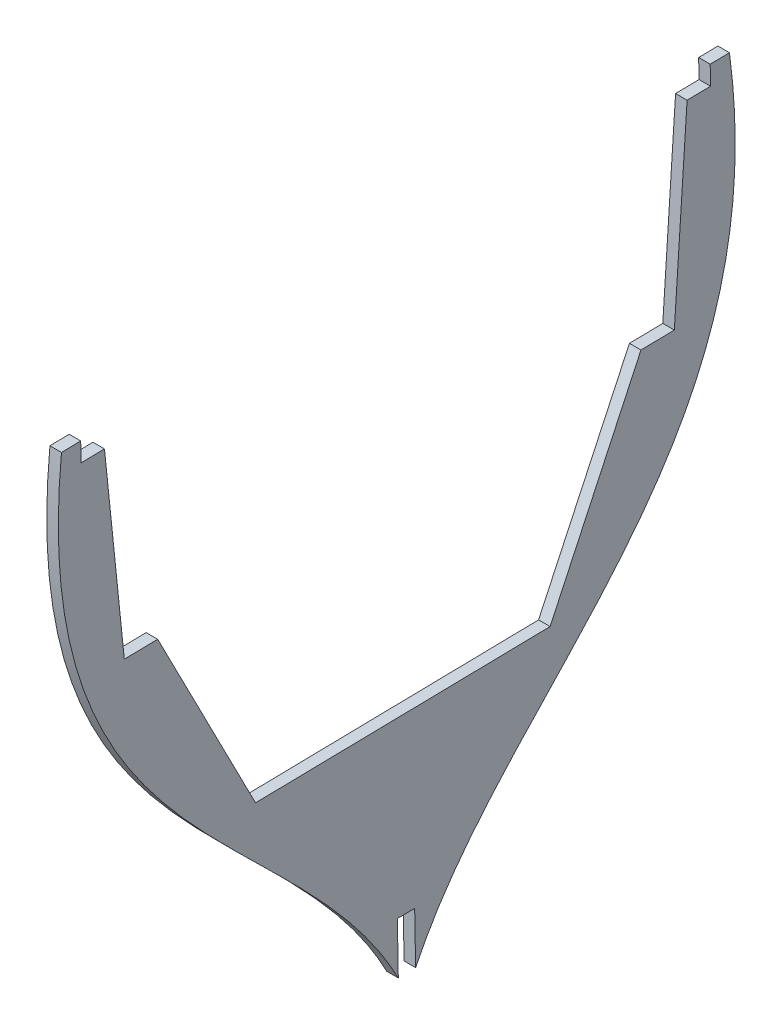
ISO-10303-21;
HEADER;
FILE_DESCRIPTION(('STEP AP214'),'2;1');
FILE_NAME('part.step','',(''),(''),'','','');
FILE_SCHEMA(('AUTOMOTIVE_DESIGN { 1 0 10303 214 1 1 1 1 }'));
ENDSEC;
DATA;
#1=APPLICATION_CONTEXT('core data for automotive mechanical design processes');
#2=APPLICATION_PROTOCOL_DEFINITION('international standard','automotive_design',2000,#1);
#3=PRODUCT_CONTEXT('',#1,'mechanical');
#4=PRODUCT('Part','Part','',(#3));
#5=PRODUCT_RELATED_PRODUCT_CATEGORY('part','',(#4));
#6=PRODUCT_DEFINITION_FORMATION('','',#4);
#7=PRODUCT_DEFINITION_CONTEXT('part definition',#1,'design');
#8=PRODUCT_DEFINITION('design','',#6,#7);
#9=PRODUCT_DEFINITION_SHAPE('','',#8);
#10=(LENGTH_UNIT() NAMED_UNIT(*) SI_UNIT(.MILLI.,.METRE.));
#11=(NAMED_UNIT(*) PLANE_ANGLE_UNIT() SI_UNIT($,.RADIAN.));
#12=(NAMED_UNIT(*) SI_UNIT($,.STERADIAN.) SOLID_ANGLE_UNIT());
#13=UNCERTAINTY_MEASURE_WITH_UNIT(LENGTH_MEASURE(1.E-05),#10,'distance_accuracy_value','');
#14=(GEOMETRIC_REPRESENTATION_CONTEXT(3) GLOBAL_UNCERTAINTY_ASSIGNED_CONTEXT((#13)) GLOBAL_UNIT_ASSIGNED_CONTEXT((#10,
#11,#12)) REPRESENTATION_CONTEXT('',''));
#15=CARTESIAN_POINT('',(0.,0.,0.));
#16=DIRECTION('',(0.,0.,1.));
#17=DIRECTION('',(1.,0.,0.));
#18=AXIS2_PLACEMENT_3D('',#15,#16,#17);
#19=CARTESIAN_POINT('',(6.,20.8163637181666,0.380736228770171));
#20=CARTESIAN_POINT('',(6.,132.00398146219,-45.1533770438092));
#21=CARTESIAN_POINT('',(6.,170.848136891112,-192.873640269721));
#22=CARTESIAN_POINT('',(6.,360.87781195214,-167.067104911544));
#23=B_SPLINE_CURVE_WITH_KNOTS('',3,(#19,#20,#21,#22),.UNSPECIFIED.,.F.,.F.,(4,4),(0.,1.),.UNSPECIFIED.);
#24=DIRECTION('',(-1.,0.,0.));
#25=VECTOR('',#24,1.);
#26=SURFACE_OF_LINEAR_EXTRUSION('',#23,#25);
#27=CARTESIAN_POINT('',(6.,30.542959421309,-3.94211466506809));
#28=VERTEX_POINT('',#27);
#29=CARTESIAN_POINT('',(6.,360.87781195214,-167.067104911544));
#30=VERTEX_POINT('',#29);
#31=EDGE_CURVE('E116',#28,#30,#23,.T.);
#32=ORIENTED_EDGE('',*,*,#31,.F.);
#33=DIRECTION('',(1.,0.,0.));
#34=VECTOR('',#33,1.);
#35=CARTESIAN_POINT('',(0.,30.542959421309,-3.94211466506809));
#36=LINE('',#35,#34);
#37=CARTESIAN_POINT('',(0.,30.542959421309,-3.94211466506809));
#38=VERTEX_POINT('',#37);
#39=EDGE_CURVE('E377',#38,#28,#36,.T.);
#40=ORIENTED_EDGE('',*,*,#39,.F.);
#41=CARTESIAN_POINT('',(0.,20.8163637181666,0.380736228770171));
#42=CARTESIAN_POINT('',(0.,132.00398146219,-45.1533770438092));
#43=CARTESIAN_POINT('',(0.,170.848136891112,-192.873640269721));
#44=CARTESIAN_POINT('',(0.,360.87781195214,-167.067104911544));
#45=B_SPLINE_CURVE_WITH_KNOTS('',3,(#41,#42,#43,#44),.UNSPECIFIED.,.F.,.F.,(4,4),(0.,1.),.UNSPECIFIED.);
#46=CARTESIAN_POINT('',(0.,360.87781195214,-167.067104911544));
#47=VERTEX_POINT('',#46);
#48=EDGE_CURVE('E185',#38,#47,#45,.T.);
#49=ORIENTED_EDGE('',*,*,#48,.T.);
#50=DIRECTION('',(-1.,0.,0.));
#51=VECTOR('',#50,1.);
#52=CARTESIAN_POINT('',(6.,360.87781195214,-167.067104911544));
#53=LINE('',#52,#51);
#54=EDGE_CURVE('E11',#30,#47,#53,.T.);
#55=ORIENTED_EDGE('',*,*,#54,.F.);
#56=EDGE_LOOP('',(#32,#40,#49,#55));
#57=FACE_BOUND('',#56,.T.);
#58=ADVANCED_FACE('F33',(#57),#26,.F.);
#59=CARTESIAN_POINT('',(6.,360.87781195214,-167.067104911544));
#60=DIRECTION('',(0.,-0.999832775568076,-0.0182871785641581));
#61=DIRECTION('',(0.,0.0182871785641581,-0.999832775568076));
#62=AXIS2_PLACEMENT_3D('',#59,#60,#61);
#63=PLANE('',#62);
#64=DIRECTION('',(0.,-0.0182871785641581,0.999832775568076));
#65=VECTOR('',#64,1.);
#66=CARTESIAN_POINT('',(0.,360.87781195214,-167.067104911544));
#67=LINE('',#66,#65);
#68=CARTESIAN_POINT('',(0.,360.694940166499,-157.068777155863));
#69=VERTEX_POINT('',#68);
#70=EDGE_CURVE('E251',#47,#69,#67,.T.);
#71=ORIENTED_EDGE('',*,*,#70,.T.);
#72=DIRECTION('',(-1.,0.,0.));
#73=VECTOR('',#72,1.);
#74=CARTESIAN_POINT('',(6.,360.694940166499,-157.068777155863));
#75=LINE('',#74,#73);
#76=CARTESIAN_POINT('',(6.,360.694940166499,-157.068777155863));
#77=VERTEX_POINT('',#76);
#78=EDGE_CURVE('E41',#77,#69,#75,.T.);
#79=ORIENTED_EDGE('',*,*,#78,.F.);
#80=DIRECTION('',(0.,-0.0182871785641581,0.999832775568076));
#81=VECTOR('',#80,1.);
#82=CARTESIAN_POINT('',(6.,360.87781195214,-167.067104911544));
#83=LINE('',#82,#81);
#84=EDGE_CURVE('E327',#30,#77,#83,.T.);
#85=ORIENTED_EDGE('',*,*,#84,.F.);
#86=ORIENTED_EDGE('',*,*,#54,.T.);
#87=EDGE_LOOP('',(#71,#79,#85,#86));
#88=FACE_BOUND('',#87,.T.);
#89=ADVANCED_FACE('F241',(#88),#63,.F.);
#90=CARTESIAN_POINT('',(6.,360.694940166499,-157.068777155863));
#91=DIRECTION('',(0.,0.0182871785641525,-0.999832775568076));
#92=DIRECTION('',(0.,0.999832775568076,0.0182871785641525));
#93=AXIS2_PLACEMENT_3D('',#90,#91,#92);
#94=PLANE('',#93);
#95=DIRECTION('',(0.,-0.999832775568076,-0.0182871785641525));
#96=VECTOR('',#95,1.);
#97=CARTESIAN_POINT('',(0.,360.694940166499,-157.068777155863));
#98=LINE('',#97,#96);
#99=CARTESIAN_POINT('',(0.,350.696612410818,-157.251648941505));
#100=VERTEX_POINT('',#99);
#101=EDGE_CURVE('E258',#69,#100,#98,.T.);
#102=ORIENTED_EDGE('',*,*,#101,.T.);
#103=DIRECTION('',(-1.,0.,0.));
#104=VECTOR('',#103,1.);
#105=CARTESIAN_POINT('',(6.,350.696612410818,-157.251648941505));
#106=LINE('',#105,#104);
#107=CARTESIAN_POINT('',(6.,350.696612410818,-157.251648941505));
#108=VERTEX_POINT('',#107);
#109=EDGE_CURVE('E262',#108,#100,#106,.T.);
#110=ORIENTED_EDGE('',*,*,#109,.F.);
#111=DIRECTION('',(0.,-0.999832775568076,-0.0182871785641525));
#112=VECTOR('',#111,1.);
#113=CARTESIAN_POINT('',(6.,360.694940166499,-157.068777155863));
#114=LINE('',#113,#112);
#115=EDGE_CURVE('E261',#77,#108,#114,.T.);
#116=ORIENTED_EDGE('',*,*,#115,.F.);
#117=ORIENTED_EDGE('',*,*,#78,.T.);
#118=EDGE_LOOP('',(#102,#110,#116,#117));
#119=FACE_BOUND('',#118,.T.);
#120=ADVANCED_FACE('F238',(#119),#94,.F.);
#121=CARTESIAN_POINT('',(6.,350.696612410818,-157.251648941505));
#122=DIRECTION('',(0.,-0.999832775568076,-0.018287178564167));
#123=DIRECTION('',(0.,0.018287178564167,-0.999832775568076));
#124=AXIS2_PLACEMENT_3D('',#121,#122,#123);
#125=PLANE('',#124);
#126=DIRECTION('',(0.,-0.018287178564167,0.999832775568076));
#127=VECTOR('',#126,1.);
#128=CARTESIAN_POINT('',(0.,350.696612410818,-157.251648941505));
#129=LINE('',#128,#127);
#130=CARTESIAN_POINT('',(0.,350.473787280884,-145.068912969083));
#131=VERTEX_POINT('',#130);
#132=EDGE_CURVE('E265',#100,#131,#129,.T.);
#133=ORIENTED_EDGE('',*,*,#132,.T.);
#134=DIRECTION('',(-1.,0.,0.));
#135=VECTOR('',#134,1.);
#136=CARTESIAN_POINT('',(6.,350.473787280884,-145.068912969083));
#137=LINE('',#136,#135);
#138=CARTESIAN_POINT('',(6.,350.473787280884,-145.068912969083));
#139=VERTEX_POINT('',#138);
#140=EDGE_CURVE('E316',#139,#131,#137,.T.);
#141=ORIENTED_EDGE('',*,*,#140,.F.);
#142=DIRECTION('',(0.,-0.018287178564167,0.999832775568076));
#143=VECTOR('',#142,1.);
#144=CARTESIAN_POINT('',(6.,350.696612410818,-157.251648941505));
#145=LINE('',#144,#143);
#146=EDGE_CURVE('E321',#108,#139,#145,.T.);
#147=ORIENTED_EDGE('',*,*,#146,.F.);
#148=ORIENTED_EDGE('',*,*,#109,.T.);
#149=EDGE_LOOP('',(#133,#141,#147,#148));
#150=FACE_BOUND('',#149,.T.);
#151=ADVANCED_FACE('F234',(#150),#125,.F.);
#152=CARTESIAN_POINT('',(6.,350.473787280884,-145.068912969083));
#153=DIRECTION('',(0.,-0.0662721826519063,-0.997801582383267));
#154=DIRECTION('',(0.,0.997801582383268,-0.0662721826519063));
#155=AXIS2_PLACEMENT_3D('',#152,#153,#154);
#156=PLANE('',#155);
#157=DIRECTION('',(0.,-0.997801582383268,0.0662721826519063));
#158=VECTOR('',#157,1.);
#159=CARTESIAN_POINT('',(0.,350.473787280884,-145.068912969083));
#160=LINE('',#159,#158);
#161=CARTESIAN_POINT('',(0.,250.335413485282,-138.417902672231));
#162=VERTEX_POINT('',#161);
#163=EDGE_CURVE('E267',#131,#162,#160,.T.);
#164=ORIENTED_EDGE('',*,*,#163,.T.);
#165=DIRECTION('',(-1.,0.,0.));
#166=VECTOR('',#165,1.);
#167=CARTESIAN_POINT('',(6.,250.335413485282,-138.417902672231));
#168=LINE('',#167,#166);
#169=CARTESIAN_POINT('',(6.,250.335413485282,-138.417902672231));
#170=VERTEX_POINT('',#169);
#171=EDGE_CURVE('E313',#170,#162,#168,.T.);
#172=ORIENTED_EDGE('',*,*,#171,.F.);
#173=DIRECTION('',(0.,-0.997801582383268,0.0662721826519063));
#174=VECTOR('',#173,1.);
#175=CARTESIAN_POINT('',(6.,350.473787280884,-145.068912969083));
#176=LINE('',#175,#174);
#177=EDGE_CURVE('E323',#139,#170,#176,.T.);
#178=ORIENTED_EDGE('',*,*,#177,.F.);
#179=ORIENTED_EDGE('',*,*,#140,.T.);
#180=EDGE_LOOP('',(#164,#172,#178,#179));
#181=FACE_BOUND('',#180,.T.);
#182=ADVANCED_FACE('F230',(#181),#156,.F.);
#183=CARTESIAN_POINT('',(6.,250.335413485282,-138.417902672231));
#184=DIRECTION('',(0.,-0.999832775568076,-0.0182871785641589));
#185=DIRECTION('',(0.,0.0182871785641589,-0.999832775568076));
#186=AXIS2_PLACEMENT_3D('',#183,#184,#185);
#187=PLANE('',#186);
#188=DIRECTION('',(0.,-0.0182871785641589,0.999832775568076));
#189=VECTOR('',#188,1.);
#190=CARTESIAN_POINT('',(0.,250.335413485282,-138.417902672231));
#191=LINE('',#190,#189);
#192=CARTESIAN_POINT('',(0.,250.018385844087,-121.084740789682));
#193=VERTEX_POINT('',#192);
#194=EDGE_CURVE('E271',#162,#193,#191,.T.);
#195=ORIENTED_EDGE('',*,*,#194,.T.);
#196=DIRECTION('',(-1.,0.,0.));
#197=VECTOR('',#196,1.);
#198=CARTESIAN_POINT('',(6.,250.018385844087,-121.084740789682));
#199=LINE('',#198,#197);
#200=CARTESIAN_POINT('',(6.,250.018385844087,-121.084740789682));
#201=VERTEX_POINT('',#200);
#202=EDGE_CURVE('E310',#201,#193,#199,.T.);
#203=ORIENTED_EDGE('',*,*,#202,.F.);
#204=DIRECTION('',(0.,-0.0182871785641589,0.999832775568076));
#205=VECTOR('',#204,1.);
#206=CARTESIAN_POINT('',(6.,250.335413485282,-138.417902672231));
#207=LINE('',#206,#205);
#208=EDGE_CURVE('E325',#170,#201,#207,.T.);
#209=ORIENTED_EDGE('',*,*,#208,.F.);
#210=ORIENTED_EDGE('',*,*,#171,.T.);
#211=EDGE_LOOP('',(#195,#203,#209,#210));
#212=FACE_BOUND('',#211,.T.);
#213=ADVANCED_FACE('F226',(#212),#187,.F.);
#214=CARTESIAN_POINT('',(6.,250.018385844087,-121.084740789682));
#215=DIRECTION('',(0.,-0.424028955537542,-0.905648632122713));
#216=DIRECTION('',(0.,0.905648632122713,-0.424028955537542));
#217=AXIS2_PLACEMENT_3D('',#214,#215,#216);
#218=PLANE('',#217);
#219=DIRECTION('',(0.,-0.905648632122713,0.424028955537542));
#220=VECTOR('',#219,1.);
#221=CARTESIAN_POINT('',(0.,250.018385844087,-121.084740789682));
#222=LINE('',#221,#220);
#223=CARTESIAN_POINT('',(0.,149.137761795491,-73.8519574208824));
#224=VERTEX_POINT('',#223);
#225=EDGE_CURVE('E273',#193,#224,#222,.T.);
#226=ORIENTED_EDGE('',*,*,#225,.T.);
#227=DIRECTION('',(-1.,0.,0.));
#228=VECTOR('',#227,1.);
#229=CARTESIAN_POINT('',(6.,149.137761795491,-73.8519574208824));
#230=LINE('',#229,#228);
#231=CARTESIAN_POINT('',(6.,149.137761795491,-73.8519574208824));
#232=VERTEX_POINT('',#231);
#233=EDGE_CURVE('E307',#232,#224,#230,.T.);
#234=ORIENTED_EDGE('',*,*,#233,.F.);
#235=DIRECTION('',(0.,-0.905648632122713,0.424028955537542));
#236=VECTOR('',#235,1.);
#237=CARTESIAN_POINT('',(6.,250.018385844087,-121.084740789682));
#238=LINE('',#237,#236);
#239=EDGE_CURVE('E332',#201,#232,#238,.T.);
#240=ORIENTED_EDGE('',*,*,#239,.F.);
#241=ORIENTED_EDGE('',*,*,#202,.T.);
#242=EDGE_LOOP('',(#226,#234,#240,#241));
#243=FACE_BOUND('',#242,.T.);
#244=ADVANCED_FACE('F222',(#243),#218,.F.);
#245=CARTESIAN_POINT('',(6.,149.137761795491,-73.8519574208824));
#246=DIRECTION('',(0.,-0.999832775568076,-0.0182871785641596));
#247=DIRECTION('',(0.,0.0182871785641596,-0.999832775568076));
#248=AXIS2_PLACEMENT_3D('',#245,#246,#247);
#249=PLANE('',#248);
#250=DIRECTION('',(0.,-0.0182871785641596,0.999832775568076));
#251=VECTOR('',#250,1.);
#252=CARTESIAN_POINT('',(0.,149.137761795491,-73.8519574208824));
#253=LINE('',#252,#251);
#254=CARTESIAN_POINT('',(0.,146.337376049039,79.2562677606414));
#255=VERTEX_POINT('',#254);
#256=EDGE_CURVE('E275',#224,#255,#253,.T.);
#257=ORIENTED_EDGE('',*,*,#256,.T.);
#258=DIRECTION('',(-1.,0.,0.));
#259=VECTOR('',#258,1.);
#260=CARTESIAN_POINT('',(6.,146.337376049039,79.2562677606414));
#261=LINE('',#260,#259);
#262=CARTESIAN_POINT('',(6.,146.337376049039,79.2562677606414));
#263=VERTEX_POINT('',#262);
#264=EDGE_CURVE('E304',#263,#255,#261,.T.);
#265=ORIENTED_EDGE('',*,*,#264,.F.);
#266=DIRECTION('',(0.,-0.0182871785641596,0.999832775568076));
#267=VECTOR('',#266,1.);
#268=CARTESIAN_POINT('',(6.,149.137761795491,-73.8519574208824));
#269=LINE('',#268,#267);
#270=EDGE_CURVE('E334',#232,#263,#269,.T.);
#271=ORIENTED_EDGE('',*,*,#270,.F.);
#272=ORIENTED_EDGE('',*,*,#233,.T.);
#273=EDGE_LOOP('',(#257,#265,#271,#272));
#274=FACE_BOUND('',#273,.T.);
#275=ADVANCED_FACE('F218',(#274),#249,.F.);
#276=CARTESIAN_POINT('',(6.,245.423307114059,130.146486842273));
#277=DIRECTION('',(0.,-0.456863324690604,0.889536903423712));
#278=DIRECTION('',(0.,-0.889536903423713,-0.456863324690605));
#279=AXIS2_PLACEMENT_3D('',#276,#277,#278);
#280=PLANE('',#279);
#281=DIRECTION('',(0.,0.889536903423713,0.456863324690605));
#282=VECTOR('',#281,1.);
#283=CARTESIAN_POINT('',(0.,245.423307114059,130.146486842273));
#284=LINE('',#283,#282);
#285=CARTESIAN_POINT('',(0.,245.423307114059,130.146486842273));
#286=VERTEX_POINT('',#285);
#287=EDGE_CURVE('E277',#255,#286,#284,.T.);
#288=ORIENTED_EDGE('',*,*,#287,.T.);
#289=DIRECTION('',(-1.,0.,0.));
#290=VECTOR('',#289,1.);
#291=CARTESIAN_POINT('',(6.,245.423307114059,130.146486842273));
#292=LINE('',#291,#290);
#293=CARTESIAN_POINT('',(6.,245.423307114059,130.146486842273));
#294=VERTEX_POINT('',#293);
#295=EDGE_CURVE('E301',#294,#286,#292,.T.);
#296=ORIENTED_EDGE('',*,*,#295,.F.);
#297=DIRECTION('',(0.,0.889536903423713,0.456863324690605));
#298=VECTOR('',#297,1.);
#299=CARTESIAN_POINT('',(6.,245.423307114059,130.146486842273));
#300=LINE('',#299,#298);
#301=EDGE_CURVE('E336',#263,#294,#300,.T.);
#302=ORIENTED_EDGE('',*,*,#301,.F.);
#303=ORIENTED_EDGE('',*,*,#264,.T.);
#304=EDGE_LOOP('',(#288,#296,#302,#303));
#305=FACE_BOUND('',#304,.T.);
#306=ADVANCED_FACE('F214',(#305),#280,.F.);
#307=CARTESIAN_POINT('',(6.,245.106279472864,147.479648724821));
#308=DIRECTION('',(0.,-0.999832775568076,-0.0182871785641621));
#309=DIRECTION('',(0.,0.0182871785641621,-0.999832775568076));
#310=AXIS2_PLACEMENT_3D('',#307,#308,#309);
#311=PLANE('',#310);
#312=DIRECTION('',(0.,-0.0182871785641621,0.999832775568076));
#313=VECTOR('',#312,1.);
#314=CARTESIAN_POINT('',(0.,245.106279472864,147.479648724821));
#315=LINE('',#314,#313);
#316=CARTESIAN_POINT('',(0.,245.106279472864,147.479648724821));
#317=VERTEX_POINT('',#316);
#318=EDGE_CURVE('E279',#286,#317,#315,.T.);
#319=ORIENTED_EDGE('',*,*,#318,.T.);
#320=DIRECTION('',(-1.,0.,0.));
#321=VECTOR('',#320,1.);
#322=CARTESIAN_POINT('',(6.,245.106279472864,147.479648724821));
#323=LINE('',#322,#321);
#324=CARTESIAN_POINT('',(6.,245.106279472864,147.479648724821));
#325=VERTEX_POINT('',#324);
#326=EDGE_CURVE('E298',#325,#317,#323,.T.);
#327=ORIENTED_EDGE('',*,*,#326,.F.);
#328=DIRECTION('',(0.,-0.0182871785641621,0.999832775568076));
#329=VECTOR('',#328,1.);
#330=CARTESIAN_POINT('',(6.,245.106279472864,147.479648724821));
#331=LINE('',#330,#329);
#332=EDGE_CURVE('E338',#294,#325,#331,.T.);
#333=ORIENTED_EDGE('',*,*,#332,.F.);
#334=ORIENTED_EDGE('',*,*,#295,.T.);
#335=EDGE_LOOP('',(#319,#327,#333,#334));
#336=FACE_BOUND('',#335,.T.);
#337=ADVANCED_FACE('F210',(#336),#311,.F.);
#338=CARTESIAN_POINT('',(6.,344.934460790876,157.788094734506));
#339=DIRECTION('',(0.,-0.102715705782987,0.994710753830229));
#340=DIRECTION('',(0.,-0.994710753830229,-0.102715705782987));
#341=AXIS2_PLACEMENT_3D('',#338,#339,#340);
#342=PLANE('',#341);
#343=DIRECTION('',(0.,0.994710753830229,0.102715705782987));
#344=VECTOR('',#343,1.);
#345=CARTESIAN_POINT('',(0.,344.934460790876,157.788094734506));
#346=LINE('',#345,#344);
#347=CARTESIAN_POINT('',(0.,344.934460790876,157.788094734506));
#348=VERTEX_POINT('',#347);
#349=EDGE_CURVE('E281',#317,#348,#346,.T.);
#350=ORIENTED_EDGE('',*,*,#349,.T.);
#351=DIRECTION('',(-1.,0.,0.));
#352=VECTOR('',#351,1.);
#353=CARTESIAN_POINT('',(6.,344.934460790876,157.788094734506));
#354=LINE('',#353,#352);
#355=CARTESIAN_POINT('',(6.,344.934460790876,157.788094734506));
#356=VERTEX_POINT('',#355);
#357=EDGE_CURVE('E171',#356,#348,#354,.T.);
#358=ORIENTED_EDGE('',*,*,#357,.F.);
#359=DIRECTION('',(0.,0.994710753830229,0.102715705782987));
#360=VECTOR('',#359,1.);
#361=CARTESIAN_POINT('',(6.,344.934460790876,157.788094734506));
#362=LINE('',#361,#360);
#363=EDGE_CURVE('E159',#325,#356,#362,.T.);
#364=ORIENTED_EDGE('',*,*,#363,.F.);
#365=ORIENTED_EDGE('',*,*,#326,.T.);
#366=EDGE_LOOP('',(#350,#358,#364,#365));
#367=FACE_BOUND('',#366,.T.);
#368=ADVANCED_FACE('F207',(#367),#342,.F.);
#369=CARTESIAN_POINT('',(6.,344.711635660943,169.970830706928));
#370=DIRECTION('',(0.,-0.999832775568076,-0.0182871785641534));
#371=DIRECTION('',(0.,0.0182871785641534,-0.999832775568076));
#372=AXIS2_PLACEMENT_3D('',#369,#370,#371);
#373=PLANE('',#372);
#374=DIRECTION('',(0.,-0.0182871785641534,0.999832775568076));
#375=VECTOR('',#374,1.);
#376=CARTESIAN_POINT('',(0.,344.711635660943,169.970830706928));
#377=LINE('',#376,#375);
#378=CARTESIAN_POINT('',(0.,344.711635660943,169.970830706928));
#379=VERTEX_POINT('',#378);
#380=EDGE_CURVE('E168',#348,#379,#377,.T.);
#381=ORIENTED_EDGE('',*,*,#380,.T.);
#382=DIRECTION('',(-1.,0.,0.));
#383=VECTOR('',#382,1.);
#384=CARTESIAN_POINT('',(6.,344.711635660943,169.970830706928));
#385=LINE('',#384,#383);
#386=CARTESIAN_POINT('',(6.,344.711635660943,169.970830706928));
#387=VERTEX_POINT('',#386);
#388=EDGE_CURVE('E165',#387,#379,#385,.T.);
#389=ORIENTED_EDGE('',*,*,#388,.F.);
#390=DIRECTION('',(0.,-0.0182871785641534,0.999832775568076));
#391=VECTOR('',#390,1.);
#392=CARTESIAN_POINT('',(6.,344.711635660943,169.970830706928));
#393=LINE('',#392,#391);
#394=EDGE_CURVE('E151',#356,#387,#393,.T.);
#395=ORIENTED_EDGE('',*,*,#394,.F.);
#396=ORIENTED_EDGE('',*,*,#357,.T.);
#397=EDGE_LOOP('',(#381,#389,#395,#396));
#398=FACE_BOUND('',#397,.T.);
#399=ADVANCED_FACE('F166',(#398),#373,.F.);
#400=CARTESIAN_POINT('',(6.,354.709963416624,170.153702492569));
#401=DIRECTION('',(0.,-0.0182871785641525,0.999832775568076));
#402=DIRECTION('',(0.,-0.999832775568076,-0.0182871785641525));
#403=AXIS2_PLACEMENT_3D('',#400,#401,#402);
#404=PLANE('',#403);
#405=DIRECTION('',(0.,0.999832775568076,0.0182871785641525));
#406=VECTOR('',#405,1.);
#407=CARTESIAN_POINT('',(0.,354.709963416624,170.153702492569));
#408=LINE('',#407,#406);
#409=CARTESIAN_POINT('',(0.,354.709963416624,170.153702492569));
#410=VERTEX_POINT('',#409);
#411=EDGE_CURVE('E284',#379,#410,#408,.T.);
#412=ORIENTED_EDGE('',*,*,#411,.T.);
#413=DIRECTION('',(-1.,0.,0.));
#414=VECTOR('',#413,1.);
#415=CARTESIAN_POINT('',(6.,354.709963416624,170.153702492569));
#416=LINE('',#415,#414);
#417=CARTESIAN_POINT('',(6.,354.709963416624,170.153702492569));
#418=VERTEX_POINT('',#417);
#419=EDGE_CURVE('E172',#418,#410,#416,.T.);
#420=ORIENTED_EDGE('',*,*,#419,.F.);
#421=DIRECTION('',(0.,0.999832775568076,0.0182871785641525));
#422=VECTOR('',#421,1.);
#423=CARTESIAN_POINT('',(6.,354.709963416624,170.153702492569));
#424=LINE('',#423,#422);
#425=EDGE_CURVE('E156',#387,#418,#424,.T.);
#426=ORIENTED_EDGE('',*,*,#425,.F.);
#427=ORIENTED_EDGE('',*,*,#388,.T.);
#428=EDGE_LOOP('',(#412,#420,#426,#427));
#429=FACE_BOUND('',#428,.T.);
#430=ADVANCED_FACE('F174',(#429),#404,.F.);
#431=CARTESIAN_POINT('',(6.,354.527091630982,180.15203024825));
#432=DIRECTION('',(0.,-0.999832775568076,-0.0182871785641581));
#433=DIRECTION('',(0.,0.0182871785641581,-0.999832775568076));
#434=AXIS2_PLACEMENT_3D('',#431,#432,#433);
#435=PLANE('',#434);
#436=DIRECTION('',(0.,-0.0182871785641581,0.999832775568076));
#437=VECTOR('',#436,1.);
#438=CARTESIAN_POINT('',(0.,354.527091630982,180.15203024825));
#439=LINE('',#438,#437);
#440=CARTESIAN_POINT('',(0.,354.527091630982,180.15203024825));
#441=VERTEX_POINT('',#440);
#442=EDGE_CURVE('E108',#410,#441,#439,.T.);
#443=ORIENTED_EDGE('',*,*,#442,.T.);
#444=DIRECTION('',(-1.,0.,0.));
#445=VECTOR('',#444,1.);
#446=CARTESIAN_POINT('',(6.,354.527091630982,180.15203024825));
#447=LINE('',#446,#445);
#448=CARTESIAN_POINT('',(6.,354.527091630982,180.15203024825));
#449=VERTEX_POINT('',#448);
#450=EDGE_CURVE('E184',#449,#441,#447,.T.);
#451=ORIENTED_EDGE('',*,*,#450,.F.);
#452=DIRECTION('',(0.,-0.0182871785641581,0.999832775568076));
#453=VECTOR('',#452,1.);
#454=CARTESIAN_POINT('',(6.,354.527091630982,180.15203024825));
#455=LINE('',#454,#453);
#456=EDGE_CURVE('E57',#418,#449,#455,.T.);
#457=ORIENTED_EDGE('',*,*,#456,.F.);
#458=ORIENTED_EDGE('',*,*,#419,.T.);
#459=EDGE_LOOP('',(#443,#451,#457,#458));
#460=FACE_BOUND('',#459,.T.);
#461=ADVANCED_FACE('F197',(#460),#435,.F.);
#462=CARTESIAN_POINT('',(6.,354.527091630982,180.15203024825));
#463=CARTESIAN_POINT('',(6.,163.680816755403,198.992254161669));
#464=CARTESIAN_POINT('',(6.,130.264512107863,49.9503299852085));
#465=CARTESIAN_POINT('',(6.,20.8163637181666,0.380736228770171));
#466=B_SPLINE_CURVE_WITH_KNOTS('',3,(#462,#463,#464,#465),.UNSPECIFIED.,.F.,.F.,(4,4),(0.,1.),.UNSPECIFIED.);
#467=DIRECTION('',(-1.,0.,0.));
#468=VECTOR('',#467,1.);
#469=SURFACE_OF_LINEAR_EXTRUSION('',#466,#468);
#470=CARTESIAN_POINT('',(0.,354.527091630982,180.15203024825));
#471=CARTESIAN_POINT('',(0.,163.680816755403,198.992254161669));
#472=CARTESIAN_POINT('',(0.,130.264512107863,49.9503299852085));
#473=CARTESIAN_POINT('',(0.,20.8163637181666,0.380736228770171));
#474=B_SPLINE_CURVE_WITH_KNOTS('',3,(#470,#471,#472,#473),.UNSPECIFIED.,.F.,.F.,(4,4),(0.,1.),.UNSPECIFIED.);
#475=CARTESIAN_POINT('',(0.,30.3783748142316,5.05638031504459));
#476=VERTEX_POINT('',#475);
#477=EDGE_CURVE('E287',#441,#476,#474,.T.);
#478=ORIENTED_EDGE('',*,*,#477,.T.);
#479=DIRECTION('',(1.,0.,0.));
#480=VECTOR('',#479,1.);
#481=CARTESIAN_POINT('',(0.,30.3783748142316,5.05638031504459));
#482=LINE('',#481,#480);
#483=CARTESIAN_POINT('',(6.,30.3783748142316,5.05638031504459));
#484=VERTEX_POINT('',#483);
#485=EDGE_CURVE('E349',#476,#484,#482,.T.);
#486=ORIENTED_EDGE('',*,*,#485,.T.);
#487=EDGE_CURVE('E176',#449,#484,#466,.T.);
#488=ORIENTED_EDGE('',*,*,#487,.F.);
#489=ORIENTED_EDGE('',*,*,#450,.T.);
#490=EDGE_LOOP('',(#478,#486,#488,#489));
#491=FACE_BOUND('',#490,.T.);
#492=ADVANCED_FACE('F193',(#491),#469,.F.);
#493=CARTESIAN_POINT('',(6.,161.281316341277,-110.095927577921));
#494=DIRECTION('',(1.,0.,0.));
#495=DIRECTION('',(0.,0.,-1.));
#496=AXIS2_PLACEMENT_3D('',#493,#494,#495);
#497=PLANE('',#496);
#498=DIRECTION('',(0.,-0.999832775568076,-0.0182871785641598));
#499=VECTOR('',#498,1.);
#500=CARTESIAN_POINT('',(6.,30.3783748142316,5.05638031504459));
#501=LINE('',#500,#499);
#502=CARTESIAN_POINT('',(6.,57.3738597545696,5.55013413627691));
#503=VERTEX_POINT('',#502);
#504=EDGE_CURVE('E353',#503,#484,#501,.T.);
#505=ORIENTED_EDGE('',*,*,#504,.F.);
#506=DIRECTION('',(0.,-0.0182871785641599,0.999832775568076));
#507=VECTOR('',#506,1.);
#508=CARTESIAN_POINT('',(6.,57.3738597545696,5.55013413627691));
#509=LINE('',#508,#507);
#510=CARTESIAN_POINT('',(6.,57.5384443616471,-3.44836084383578));
#511=VERTEX_POINT('',#510);
#512=EDGE_CURVE('E371',#511,#503,#509,.T.);
#513=ORIENTED_EDGE('',*,*,#512,.F.);
#514=DIRECTION('',(0.,0.999832775568076,0.0182871785641597));
#515=VECTOR('',#514,1.);
#516=CARTESIAN_POINT('',(6.,57.5384443616471,-3.44836084383578));
#517=LINE('',#516,#515);
#518=EDGE_CURVE('E384',#28,#511,#517,.T.);
#519=ORIENTED_EDGE('',*,*,#518,.F.);
#520=ORIENTED_EDGE('',*,*,#31,.T.);
#521=ORIENTED_EDGE('',*,*,#84,.T.);
#522=ORIENTED_EDGE('',*,*,#115,.T.);
#523=ORIENTED_EDGE('',*,*,#146,.T.);
#524=ORIENTED_EDGE('',*,*,#177,.T.);
#525=ORIENTED_EDGE('',*,*,#208,.T.);
#526=ORIENTED_EDGE('',*,*,#239,.T.);
#527=ORIENTED_EDGE('',*,*,#270,.T.);
#528=ORIENTED_EDGE('',*,*,#301,.T.);
#529=ORIENTED_EDGE('',*,*,#332,.T.);
#530=ORIENTED_EDGE('',*,*,#363,.T.);
#531=ORIENTED_EDGE('',*,*,#394,.T.);
#532=ORIENTED_EDGE('',*,*,#425,.T.);
#533=ORIENTED_EDGE('',*,*,#456,.T.);
#534=ORIENTED_EDGE('',*,*,#487,.T.);
#535=EDGE_LOOP('',(#505,#513,#519,#520,#521,#522,#523,#524,#525,#526,#527,#528,#529,#530,#531,
#532,#533,#534));
#536=FACE_BOUND('',#535,.T.);
#537=ADVANCED_FACE('F154',(#536),#497,.T.);
#538=CARTESIAN_POINT('',(0.,161.281316341277,-110.095927577921));
#539=DIRECTION('',(1.,0.,0.));
#540=DIRECTION('',(0.,0.,-1.));
#541=AXIS2_PLACEMENT_3D('',#538,#539,#540);
#542=PLANE('',#541);
#543=DIRECTION('',(0.,-0.0182871785641599,0.999832775568076));
#544=VECTOR('',#543,1.);
#545=CARTESIAN_POINT('',(0.,57.3738597545696,5.55013413627691));
#546=LINE('',#545,#544);
#547=CARTESIAN_POINT('',(0.,57.5384443616471,-3.44836084383577));
#548=VERTEX_POINT('',#547);
#549=CARTESIAN_POINT('',(0.,57.3738597545696,5.55013413627691));
#550=VERTEX_POINT('',#549);
#551=EDGE_CURVE('E48',#548,#550,#546,.T.);
#552=ORIENTED_EDGE('',*,*,#551,.T.);
#553=DIRECTION('',(0.,-0.999832775568076,-0.0182871785641598));
#554=VECTOR('',#553,1.);
#555=CARTESIAN_POINT('',(0.,30.3783748142316,5.05638031504459));
#556=LINE('',#555,#554);
#557=EDGE_CURVE('E375',#550,#476,#556,.T.);
#558=ORIENTED_EDGE('',*,*,#557,.T.);
#559=ORIENTED_EDGE('',*,*,#477,.F.);
#560=ORIENTED_EDGE('',*,*,#442,.F.);
#561=ORIENTED_EDGE('',*,*,#411,.F.);
#562=ORIENTED_EDGE('',*,*,#380,.F.);
#563=ORIENTED_EDGE('',*,*,#349,.F.);
#564=ORIENTED_EDGE('',*,*,#318,.F.);
#565=ORIENTED_EDGE('',*,*,#287,.F.);
#566=ORIENTED_EDGE('',*,*,#256,.F.);
#567=ORIENTED_EDGE('',*,*,#225,.F.);
#568=ORIENTED_EDGE('',*,*,#194,.F.);
#569=ORIENTED_EDGE('',*,*,#163,.F.);
#570=ORIENTED_EDGE('',*,*,#132,.F.);
#571=ORIENTED_EDGE('',*,*,#101,.F.);
#572=ORIENTED_EDGE('',*,*,#70,.F.);
#573=ORIENTED_EDGE('',*,*,#48,.F.);
#574=DIRECTION('',(0.,0.999832775568076,0.0182871785641597));
#575=VECTOR('',#574,1.);
#576=CARTESIAN_POINT('',(0.,57.5384443616471,-3.44836084383578));
#577=LINE('',#576,#575);
#578=EDGE_CURVE('E380',#38,#548,#577,.T.);
#579=ORIENTED_EDGE('',*,*,#578,.T.);
#580=EDGE_LOOP('',(#552,#558,#559,#560,#561,#562,#563,#564,#565,#566,#567,#568,#569,#570,#571,
#572,#573,#579));
#581=FACE_BOUND('',#580,.T.);
#582=ADVANCED_FACE('F199',(#581),#542,.F.);
#583=CARTESIAN_POINT('',(0.,30.3783748142316,5.05638031504459));
#584=DIRECTION('',(0.,-0.0182871785641598,0.999832775568076));
#585=DIRECTION('',(0.,-0.999832775568076,-0.0182871785641598));
#586=AXIS2_PLACEMENT_3D('',#583,#584,#585);
#587=PLANE('',#586);
#588=ORIENTED_EDGE('',*,*,#504,.T.);
#589=ORIENTED_EDGE('',*,*,#485,.F.);
#590=ORIENTED_EDGE('',*,*,#557,.F.);
#591=DIRECTION('',(1.,0.,0.));
#592=VECTOR('',#591,1.);
#593=CARTESIAN_POINT('',(0.,57.3738597545696,5.55013413627691));
#594=LINE('',#593,#592);
#595=EDGE_CURVE('E362',#550,#503,#594,.T.);
#596=ORIENTED_EDGE('',*,*,#595,.T.);
#597=EDGE_LOOP('',(#588,#589,#590,#596));
#598=FACE_BOUND('',#597,.T.);
#599=ADVANCED_FACE('F376',(#598),#587,.F.);
#600=CARTESIAN_POINT('',(0.,57.3738597545696,5.55013413627691));
#601=DIRECTION('',(0.,0.999832775568076,0.0182871785641599));
#602=DIRECTION('',(0.,-0.0182871785641599,0.999832775568076));
#603=AXIS2_PLACEMENT_3D('',#600,#601,#602);
#604=PLANE('',#603);
#605=ORIENTED_EDGE('',*,*,#512,.T.);
#606=ORIENTED_EDGE('',*,*,#595,.F.);
#607=ORIENTED_EDGE('',*,*,#551,.F.);
#608=DIRECTION('',(1.,0.,0.));
#609=VECTOR('',#608,1.);
#610=CARTESIAN_POINT('',(0.,57.5384443616471,-3.44836084383578));
#611=LINE('',#610,#609);
#612=EDGE_CURVE('E372',#548,#511,#611,.T.);
#613=ORIENTED_EDGE('',*,*,#612,.T.);
#614=EDGE_LOOP('',(#605,#606,#607,#613));
#615=FACE_BOUND('',#614,.T.);
#616=ADVANCED_FACE('F370',(#615),#604,.F.);
#617=CARTESIAN_POINT('',(0.,57.5384443616471,-3.44836084383578));
#618=DIRECTION('',(0.,0.0182871785641597,-0.999832775568076));
#619=DIRECTION('',(0.,0.999832775568076,0.0182871785641597));
#620=AXIS2_PLACEMENT_3D('',#617,#618,#619);
#621=PLANE('',#620);
#622=ORIENTED_EDGE('',*,*,#518,.T.);
#623=ORIENTED_EDGE('',*,*,#612,.F.);
#624=ORIENTED_EDGE('',*,*,#578,.F.);
#625=ORIENTED_EDGE('',*,*,#39,.T.);
#626=EDGE_LOOP('',(#622,#623,#624,#625));
#627=FACE_BOUND('',#626,.T.);
#628=ADVANCED_FACE('F399',(#627),#621,.F.);
#629=CLOSED_SHELL('',(#58,#89,#120,#151,#182,#213,#244,#275,#306,#337,#368,#399,#430,#461,#492,
#537,#582,#599,#616,#628));
#630=MANIFOLD_SOLID_BREP('B2',#629);
#631=ADVANCED_BREP_SHAPE_REPRESENTATION('',(#18,#630),#14);
#632=SHAPE_DEFINITION_REPRESENTATION(#9,#631);
ENDSEC;
END-ISO-10303-21;
